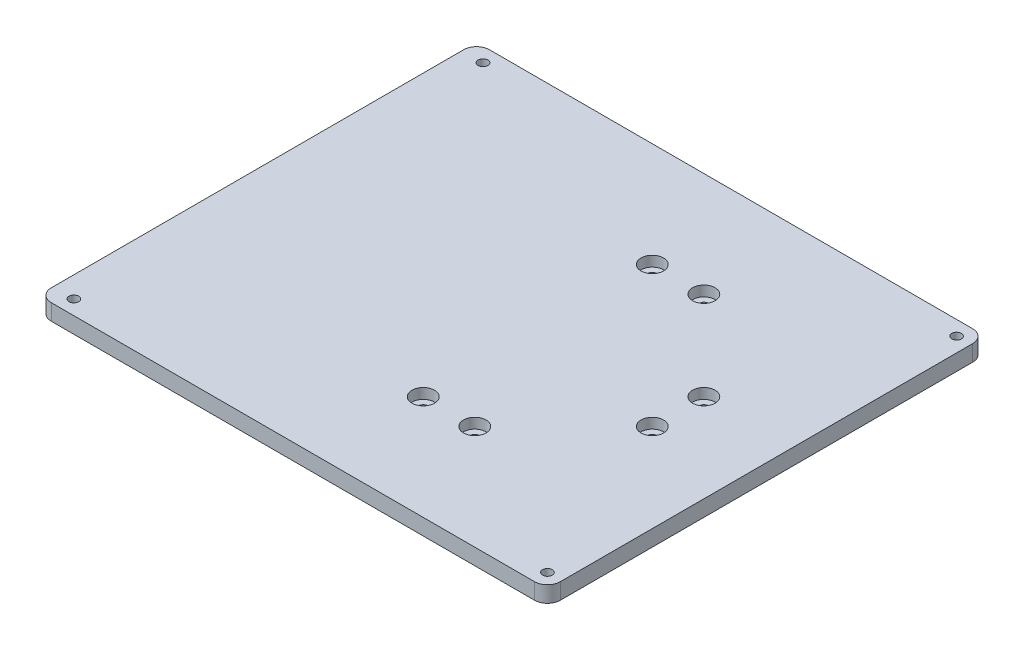
ISO-10303-21;
HEADER;
FILE_DESCRIPTION(('STEP AP214'),'2;1');
FILE_NAME('part.step','',(''),(''),'','','');
FILE_SCHEMA(('AUTOMOTIVE_DESIGN { 1 0 10303 214 1 1 1 1 }'));
ENDSEC;
DATA;
#1=APPLICATION_CONTEXT('core data for automotive mechanical design processes');
#2=APPLICATION_PROTOCOL_DEFINITION('international standard','automotive_design',2000,#1);
#3=PRODUCT_CONTEXT('',#1,'mechanical');
#4=PRODUCT('Part','Part','',(#3));
#5=PRODUCT_RELATED_PRODUCT_CATEGORY('part','',(#4));
#6=PRODUCT_DEFINITION_FORMATION('','',#4);
#7=PRODUCT_DEFINITION_CONTEXT('part definition',#1,'design');
#8=PRODUCT_DEFINITION('design','',#6,#7);
#9=PRODUCT_DEFINITION_SHAPE('','',#8);
#10=(LENGTH_UNIT() NAMED_UNIT(*) SI_UNIT(.MILLI.,.METRE.));
#11=(NAMED_UNIT(*) PLANE_ANGLE_UNIT() SI_UNIT($,.RADIAN.));
#12=(NAMED_UNIT(*) SI_UNIT($,.STERADIAN.) SOLID_ANGLE_UNIT());
#13=UNCERTAINTY_MEASURE_WITH_UNIT(LENGTH_MEASURE(1.E-05),#10,'distance_accuracy_value','');
#14=(GEOMETRIC_REPRESENTATION_CONTEXT(3) GLOBAL_UNCERTAINTY_ASSIGNED_CONTEXT((#13)) GLOBAL_UNIT_ASSIGNED_CONTEXT((#10,
#11,#12)) REPRESENTATION_CONTEXT('',''));
#15=CARTESIAN_POINT('',(0.,0.,0.));
#16=DIRECTION('',(0.,0.,1.));
#17=DIRECTION('',(1.,0.,0.));
#18=AXIS2_PLACEMENT_3D('',#15,#16,#17);
#19=CARTESIAN_POINT('',(24.,0.,-35.55));
#20=DIRECTION('',(0.,1.,0.));
#21=DIRECTION('',(0.,0.,1.));
#22=AXIS2_PLACEMENT_3D('',#19,#20,#21);
#23=CYLINDRICAL_SURFACE('',#22,1.5);
#24=CARTESIAN_POINT('',(24.,0.,-35.55));
#25=DIRECTION('',(0.,1.,0.));
#26=DIRECTION('',(0.,0.,1.));
#27=AXIS2_PLACEMENT_3D('',#24,#25,#26);
#28=CIRCLE('',#27,1.5);
#29=CARTESIAN_POINT('',(24.,0.,-34.05));
#30=VERTEX_POINT('',#29);
#31=EDGE_CURVE('E201',#30,#30,#28,.T.);
#32=ORIENTED_EDGE('',*,*,#31,.F.);
#33=EDGE_LOOP('',(#32));
#34=FACE_BOUND('',#33,.T.);
#35=CARTESIAN_POINT('',(24.,1.8,-35.55));
#36=DIRECTION('',(0.,1.,0.));
#37=DIRECTION('',(0.,0.,1.));
#38=AXIS2_PLACEMENT_3D('',#35,#36,#37);
#39=CIRCLE('',#38,1.5);
#40=CARTESIAN_POINT('',(24.,1.8,-34.05));
#41=VERTEX_POINT('',#40);
#42=EDGE_CURVE('E45',#41,#41,#39,.F.);
#43=ORIENTED_EDGE('',*,*,#42,.F.);
#44=EDGE_LOOP('',(#43));
#45=FACE_BOUND('',#44,.T.);
#46=ADVANCED_FACE('F41',(#34,#45),#23,.F.);
#47=CARTESIAN_POINT('',(51.55,0.,-7.99999999999999));
#48=DIRECTION('',(0.,1.,0.));
#49=DIRECTION('',(0.,0.,1.));
#50=AXIS2_PLACEMENT_3D('',#47,#48,#49);
#51=CYLINDRICAL_SURFACE('',#50,1.5);
#52=CARTESIAN_POINT('',(51.55,0.,-7.99999999999999));
#53=DIRECTION('',(0.,1.,0.));
#54=DIRECTION('',(0.,0.,-1.));
#55=AXIS2_PLACEMENT_3D('',#52,#53,#54);
#56=CIRCLE('',#55,1.5);
#57=CARTESIAN_POINT('',(51.55,0.,-9.49999999999999));
#58=VERTEX_POINT('',#57);
#59=EDGE_CURVE('E183',#58,#58,#56,.T.);
#60=ORIENTED_EDGE('',*,*,#59,.F.);
#61=EDGE_LOOP('',(#60));
#62=FACE_BOUND('',#61,.T.);
#63=CARTESIAN_POINT('',(51.55,1.8,-7.99999999999999));
#64=DIRECTION('',(0.,1.,0.));
#65=DIRECTION('',(0.,0.,1.));
#66=AXIS2_PLACEMENT_3D('',#63,#64,#65);
#67=CIRCLE('',#66,1.5);
#68=CARTESIAN_POINT('',(51.55,1.8,-6.5));
#69=VERTEX_POINT('',#68);
#70=EDGE_CURVE('E178',#69,#69,#67,.F.);
#71=ORIENTED_EDGE('',*,*,#70,.F.);
#72=EDGE_LOOP('',(#71));
#73=FACE_BOUND('',#72,.T.);
#74=ADVANCED_FACE('F263',(#62,#73),#51,.F.);
#75=CARTESIAN_POINT('',(51.55,0.,8.00000000000001));
#76=DIRECTION('',(0.,1.,0.));
#77=DIRECTION('',(0.,0.,1.));
#78=AXIS2_PLACEMENT_3D('',#75,#76,#77);
#79=CYLINDRICAL_SURFACE('',#78,1.5);
#80=CARTESIAN_POINT('',(51.55,0.,8.00000000000001));
#81=DIRECTION('',(0.,1.,0.));
#82=DIRECTION('',(0.,0.,1.));
#83=AXIS2_PLACEMENT_3D('',#80,#81,#82);
#84=CIRCLE('',#83,1.5);
#85=CARTESIAN_POINT('',(51.55,0.,9.5));
#86=VERTEX_POINT('',#85);
#87=EDGE_CURVE('E187',#86,#86,#84,.T.);
#88=ORIENTED_EDGE('',*,*,#87,.F.);
#89=EDGE_LOOP('',(#88));
#90=FACE_BOUND('',#89,.T.);
#91=CARTESIAN_POINT('',(51.55,1.8,8.00000000000001));
#92=DIRECTION('',(0.,1.,0.));
#93=DIRECTION('',(0.,0.,1.));
#94=AXIS2_PLACEMENT_3D('',#91,#92,#93);
#95=CIRCLE('',#94,1.5);
#96=CARTESIAN_POINT('',(51.55,1.8,9.5));
#97=VERTEX_POINT('',#96);
#98=EDGE_CURVE('E176',#97,#97,#95,.F.);
#99=ORIENTED_EDGE('',*,*,#98,.F.);
#100=EDGE_LOOP('',(#99));
#101=FACE_BOUND('',#100,.T.);
#102=ADVANCED_FACE('F270',(#90,#101),#79,.F.);
#103=CARTESIAN_POINT('',(8.00000000000001,0.,-35.55));
#104=DIRECTION('',(0.,1.,0.));
#105=DIRECTION('',(0.,0.,1.));
#106=AXIS2_PLACEMENT_3D('',#103,#104,#105);
#107=CYLINDRICAL_SURFACE('',#106,1.5);
#108=CARTESIAN_POINT('',(8.00000000000001,0.,-35.55));
#109=DIRECTION('',(0.,1.,0.));
#110=DIRECTION('',(0.,0.,-1.));
#111=AXIS2_PLACEMENT_3D('',#108,#109,#110);
#112=CIRCLE('',#111,1.5);
#113=CARTESIAN_POINT('',(8.00000000000001,0.,-37.05));
#114=VERTEX_POINT('',#113);
#115=EDGE_CURVE('E192',#114,#114,#112,.T.);
#116=ORIENTED_EDGE('',*,*,#115,.F.);
#117=EDGE_LOOP('',(#116));
#118=FACE_BOUND('',#117,.T.);
#119=CARTESIAN_POINT('',(8.00000000000001,1.8,-35.55));
#120=DIRECTION('',(0.,1.,0.));
#121=DIRECTION('',(0.,0.,1.));
#122=AXIS2_PLACEMENT_3D('',#119,#120,#121);
#123=CIRCLE('',#122,1.5);
#124=CARTESIAN_POINT('',(8.00000000000001,1.8,-34.05));
#125=VERTEX_POINT('',#124);
#126=EDGE_CURVE('E173',#125,#125,#123,.F.);
#127=ORIENTED_EDGE('',*,*,#126,.F.);
#128=EDGE_LOOP('',(#127));
#129=FACE_BOUND('',#128,.T.);
#130=ADVANCED_FACE('F315',(#118,#129),#107,.F.);
#131=CARTESIAN_POINT('',(8.,0.,35.55));
#132=DIRECTION('',(0.,1.,0.));
#133=DIRECTION('',(0.,0.,1.));
#134=AXIS2_PLACEMENT_3D('',#131,#132,#133);
#135=CYLINDRICAL_SURFACE('',#134,1.5);
#136=CARTESIAN_POINT('',(8.,0.,35.55));
#137=DIRECTION('',(0.,1.,0.));
#138=DIRECTION('',(0.,0.,1.));
#139=AXIS2_PLACEMENT_3D('',#136,#137,#138);
#140=CIRCLE('',#139,1.5);
#141=CARTESIAN_POINT('',(8.,0.,37.05));
#142=VERTEX_POINT('',#141);
#143=EDGE_CURVE('E202',#142,#142,#140,.T.);
#144=ORIENTED_EDGE('',*,*,#143,.F.);
#145=EDGE_LOOP('',(#144));
#146=FACE_BOUND('',#145,.T.);
#147=CARTESIAN_POINT('',(8.,1.8,35.55));
#148=DIRECTION('',(0.,1.,0.));
#149=DIRECTION('',(0.,0.,1.));
#150=AXIS2_PLACEMENT_3D('',#147,#148,#149);
#151=CIRCLE('',#150,1.5);
#152=CARTESIAN_POINT('',(8.,1.8,37.05));
#153=VERTEX_POINT('',#152);
#154=EDGE_CURVE('E169',#153,#153,#151,.F.);
#155=ORIENTED_EDGE('',*,*,#154,.F.);
#156=EDGE_LOOP('',(#155));
#157=FACE_BOUND('',#156,.T.);
#158=ADVANCED_FACE('F357',(#146,#157),#135,.F.);
#159=CARTESIAN_POINT('',(24.,0.,35.55));
#160=DIRECTION('',(0.,1.,0.));
#161=DIRECTION('',(0.,0.,1.));
#162=AXIS2_PLACEMENT_3D('',#159,#160,#161);
#163=CYLINDRICAL_SURFACE('',#162,1.5);
#164=CARTESIAN_POINT('',(24.,0.,35.55));
#165=DIRECTION('',(0.,1.,0.));
#166=DIRECTION('',(0.,0.,-1.));
#167=AXIS2_PLACEMENT_3D('',#164,#165,#166);
#168=CIRCLE('',#167,1.5);
#169=CARTESIAN_POINT('',(24.,0.,34.05));
#170=VERTEX_POINT('',#169);
#171=EDGE_CURVE('E198',#170,#170,#168,.T.);
#172=ORIENTED_EDGE('',*,*,#171,.F.);
#173=EDGE_LOOP('',(#172));
#174=FACE_BOUND('',#173,.T.);
#175=CARTESIAN_POINT('',(24.,1.8,35.55));
#176=DIRECTION('',(0.,1.,0.));
#177=DIRECTION('',(0.,0.,1.));
#178=AXIS2_PLACEMENT_3D('',#175,#176,#177);
#179=CIRCLE('',#178,1.5);
#180=CARTESIAN_POINT('',(24.,1.8,37.05));
#181=VERTEX_POINT('',#180);
#182=EDGE_CURVE('E166',#181,#181,#179,.F.);
#183=ORIENTED_EDGE('',*,*,#182,.F.);
#184=EDGE_LOOP('',(#183));
#185=FACE_BOUND('',#184,.T.);
#186=ADVANCED_FACE('F295',(#174,#185),#163,.F.);
#187=CARTESIAN_POINT('',(0.,5.,0.));
#188=DIRECTION('',(0.,1.,0.));
#189=DIRECTION('',(0.,0.,1.));
#190=AXIS2_PLACEMENT_3D('',#187,#188,#189);
#191=PLANE('',#190);
#192=CARTESIAN_POINT('',(8.00000000000001,5.,-35.55));
#193=DIRECTION('',(0.,1.,0.));
#194=DIRECTION('',(0.,0.,1.));
#195=AXIS2_PLACEMENT_3D('',#192,#193,#194);
#196=CIRCLE('',#195,3.5);
#197=CARTESIAN_POINT('',(8.00000000000001,5.,-32.05));
#198=VERTEX_POINT('',#197);
#199=EDGE_CURVE('E410',#198,#198,#196,.T.);
#200=ORIENTED_EDGE('',*,*,#199,.F.);
#201=EDGE_LOOP('',(#200));
#202=FACE_BOUND('',#201,.T.);
#203=CARTESIAN_POINT('',(51.55,5.,-7.99999999999999));
#204=DIRECTION('',(0.,1.,0.));
#205=DIRECTION('',(0.,0.,1.));
#206=AXIS2_PLACEMENT_3D('',#203,#204,#205);
#207=CIRCLE('',#206,3.5);
#208=CARTESIAN_POINT('',(51.55,5.,-4.5));
#209=VERTEX_POINT('',#208);
#210=EDGE_CURVE('E389',#209,#209,#207,.T.);
#211=ORIENTED_EDGE('',*,*,#210,.F.);
#212=EDGE_LOOP('',(#211));
#213=FACE_BOUND('',#212,.T.);
#214=CARTESIAN_POINT('',(51.55,5.,8.00000000000001));
#215=DIRECTION('',(0.,1.,0.));
#216=DIRECTION('',(0.,0.,1.));
#217=AXIS2_PLACEMENT_3D('',#214,#215,#216);
#218=CIRCLE('',#217,3.5);
#219=CARTESIAN_POINT('',(51.55,5.,11.5));
#220=VERTEX_POINT('',#219);
#221=EDGE_CURVE('E390',#220,#220,#218,.T.);
#222=ORIENTED_EDGE('',*,*,#221,.F.);
#223=EDGE_LOOP('',(#222));
#224=FACE_BOUND('',#223,.T.);
#225=CARTESIAN_POINT('',(24.,5.,35.55));
#226=DIRECTION('',(0.,1.,0.));
#227=DIRECTION('',(0.,0.,1.));
#228=AXIS2_PLACEMENT_3D('',#225,#226,#227);
#229=CIRCLE('',#228,3.5);
#230=CARTESIAN_POINT('',(24.,5.,39.05));
#231=VERTEX_POINT('',#230);
#232=EDGE_CURVE('E401',#231,#231,#229,.T.);
#233=ORIENTED_EDGE('',*,*,#232,.F.);
#234=EDGE_LOOP('',(#233));
#235=FACE_BOUND('',#234,.T.);
#236=CARTESIAN_POINT('',(8.,5.,35.55));
#237=DIRECTION('',(0.,1.,0.));
#238=DIRECTION('',(0.,0.,1.));
#239=AXIS2_PLACEMENT_3D('',#236,#237,#238);
#240=CIRCLE('',#239,3.5);
#241=CARTESIAN_POINT('',(8.,5.,39.05));
#242=VERTEX_POINT('',#241);
#243=EDGE_CURVE('E406',#242,#242,#240,.T.);
#244=ORIENTED_EDGE('',*,*,#243,.F.);
#245=EDGE_LOOP('',(#244));
#246=FACE_BOUND('',#245,.T.);
#247=CARTESIAN_POINT('',(24.,5.,-35.55));
#248=DIRECTION('',(0.,1.,0.));
#249=DIRECTION('',(0.,0.,1.));
#250=AXIS2_PLACEMENT_3D('',#247,#248,#249);
#251=CIRCLE('',#250,3.5);
#252=CARTESIAN_POINT('',(24.,5.,-32.05));
#253=VERTEX_POINT('',#252);
#254=EDGE_CURVE('E196',#253,#253,#251,.T.);
#255=ORIENTED_EDGE('',*,*,#254,.F.);
#256=EDGE_LOOP('',(#255));
#257=FACE_BOUND('',#256,.T.);
#258=CARTESIAN_POINT('',(-72.4999999999997,5.,63.5000000000006));
#259=DIRECTION('',(0.,1.,0.));
#260=DIRECTION('',(0.,0.,-1.));
#261=AXIS2_PLACEMENT_3D('',#258,#259,#260);
#262=CIRCLE('',#261,1.5);
#263=CARTESIAN_POINT('',(-72.4999999999997,5.,62.0000000000006));
#264=VERTEX_POINT('',#263);
#265=EDGE_CURVE('E216',#264,#264,#262,.T.);
#266=ORIENTED_EDGE('',*,*,#265,.F.);
#267=EDGE_LOOP('',(#266));
#268=FACE_BOUND('',#267,.T.);
#269=CARTESIAN_POINT('',(74.5,5.,-63.5));
#270=DIRECTION('',(0.,1.,0.));
#271=DIRECTION('',(0.,0.,1.));
#272=AXIS2_PLACEMENT_3D('',#269,#270,#271);
#273=CIRCLE('',#272,1.5);
#274=CARTESIAN_POINT('',(74.5,5.,-62.));
#275=VERTEX_POINT('',#274);
#276=EDGE_CURVE('E228',#275,#275,#273,.T.);
#277=ORIENTED_EDGE('',*,*,#276,.F.);
#278=EDGE_LOOP('',(#277));
#279=FACE_BOUND('',#278,.T.);
#280=DIRECTION('',(0.,0.,1.));
#281=VECTOR('',#280,1.);
#282=CARTESIAN_POINT('',(-79.,5.,-68.));
#283=LINE('',#282,#281);
#284=CARTESIAN_POINT('',(-79.,5.,-64.));
#285=VERTEX_POINT('',#284);
#286=CARTESIAN_POINT('',(-79.,5.,64.));
#287=VERTEX_POINT('',#286);
#288=EDGE_CURVE('E235',#285,#287,#283,.T.);
#289=ORIENTED_EDGE('',*,*,#288,.T.);
#290=CARTESIAN_POINT('',(-75.,5.,64.));
#291=DIRECTION('',(0.,1.,0.));
#292=DIRECTION('',(0.,0.,1.));
#293=AXIS2_PLACEMENT_3D('',#290,#291,#292);
#294=CIRCLE('',#293,4.);
#295=CARTESIAN_POINT('',(-75.,5.,68.));
#296=VERTEX_POINT('',#295);
#297=EDGE_CURVE('E158',#287,#296,#294,.T.);
#298=ORIENTED_EDGE('',*,*,#297,.T.);
#299=DIRECTION('',(1.,0.,0.));
#300=VECTOR('',#299,1.);
#301=CARTESIAN_POINT('',(-79.,5.,68.));
#302=LINE('',#301,#300);
#303=CARTESIAN_POINT('',(75.,5.,68.));
#304=VERTEX_POINT('',#303);
#305=EDGE_CURVE('E129',#296,#304,#302,.T.);
#306=ORIENTED_EDGE('',*,*,#305,.T.);
#307=CARTESIAN_POINT('',(75.,5.,64.));
#308=DIRECTION('',(0.,1.,0.));
#309=DIRECTION('',(0.,0.,1.));
#310=AXIS2_PLACEMENT_3D('',#307,#308,#309);
#311=CIRCLE('',#310,4.);
#312=CARTESIAN_POINT('',(79.,5.,64.));
#313=VERTEX_POINT('',#312);
#314=EDGE_CURVE('E153',#304,#313,#311,.T.);
#315=ORIENTED_EDGE('',*,*,#314,.T.);
#316=DIRECTION('',(0.,0.,-1.));
#317=VECTOR('',#316,1.);
#318=CARTESIAN_POINT('',(79.,5.,-68.));
#319=LINE('',#318,#317);
#320=CARTESIAN_POINT('',(79.,5.,-64.));
#321=VERTEX_POINT('',#320);
#322=EDGE_CURVE('E136',#313,#321,#319,.T.);
#323=ORIENTED_EDGE('',*,*,#322,.T.);
#324=CARTESIAN_POINT('',(75.,5.,-64.));
#325=DIRECTION('',(0.,1.,0.));
#326=DIRECTION('',(0.,0.,1.));
#327=AXIS2_PLACEMENT_3D('',#324,#325,#326);
#328=CIRCLE('',#327,4.);
#329=CARTESIAN_POINT('',(75.,5.,-68.));
#330=VERTEX_POINT('',#329);
#331=EDGE_CURVE('E65',#321,#330,#328,.T.);
#332=ORIENTED_EDGE('',*,*,#331,.T.);
#333=DIRECTION('',(-1.,0.,0.));
#334=VECTOR('',#333,1.);
#335=CARTESIAN_POINT('',(-79.,5.,-68.));
#336=LINE('',#335,#334);
#337=CARTESIAN_POINT('',(-75.,5.,-68.));
#338=VERTEX_POINT('',#337);
#339=EDGE_CURVE('E139',#330,#338,#336,.T.);
#340=ORIENTED_EDGE('',*,*,#339,.T.);
#341=CARTESIAN_POINT('',(-75.,5.,-64.));
#342=DIRECTION('',(0.,1.,0.));
#343=DIRECTION('',(0.,0.,1.));
#344=AXIS2_PLACEMENT_3D('',#341,#342,#343);
#345=CIRCLE('',#344,4.);
#346=EDGE_CURVE('E156',#338,#285,#345,.T.);
#347=ORIENTED_EDGE('',*,*,#346,.T.);
#348=EDGE_LOOP('',(#289,#298,#306,#315,#323,#332,#340,#347));
#349=FACE_BOUND('',#348,.T.);
#350=CARTESIAN_POINT('',(-72.5,5.,-63.5));
#351=DIRECTION('',(0.,1.,0.));
#352=DIRECTION('',(0.,0.,1.));
#353=AXIS2_PLACEMENT_3D('',#350,#351,#352);
#354=CIRCLE('',#353,1.5);
#355=CARTESIAN_POINT('',(-72.5,5.,-62.));
#356=VERTEX_POINT('',#355);
#357=EDGE_CURVE('E222',#356,#356,#354,.T.);
#358=ORIENTED_EDGE('',*,*,#357,.F.);
#359=EDGE_LOOP('',(#358));
#360=FACE_BOUND('',#359,.T.);
#361=CARTESIAN_POINT('',(74.5000000000002,5.,63.5));
#362=DIRECTION('',(0.,1.,0.));
#363=DIRECTION('',(0.,0.,-1.));
#364=AXIS2_PLACEMENT_3D('',#361,#362,#363);
#365=CIRCLE('',#364,1.49999999999999);
#366=CARTESIAN_POINT('',(74.5000000000002,5.,62.));
#367=VERTEX_POINT('',#366);
#368=EDGE_CURVE('E210',#367,#367,#365,.T.);
#369=ORIENTED_EDGE('',*,*,#368,.F.);
#370=EDGE_LOOP('',(#369));
#371=FACE_BOUND('',#370,.T.);
#372=ADVANCED_FACE('F248',(#202,#213,#224,#235,#246,#257,#268,#279,#349,#360,#371),#191,.T.);
#373=CARTESIAN_POINT('',(0.,0.,0.));
#374=DIRECTION('',(0.,1.,0.));
#375=DIRECTION('',(0.,0.,1.));
#376=AXIS2_PLACEMENT_3D('',#373,#374,#375);
#377=PLANE('',#376);
#378=ORIENTED_EDGE('',*,*,#171,.T.);
#379=EDGE_LOOP('',(#378));
#380=FACE_BOUND('',#379,.T.);
#381=ORIENTED_EDGE('',*,*,#143,.T.);
#382=EDGE_LOOP('',(#381));
#383=FACE_BOUND('',#382,.T.);
#384=ORIENTED_EDGE('',*,*,#115,.T.);
#385=EDGE_LOOP('',(#384));
#386=FACE_BOUND('',#385,.T.);
#387=ORIENTED_EDGE('',*,*,#87,.T.);
#388=EDGE_LOOP('',(#387));
#389=FACE_BOUND('',#388,.T.);
#390=ORIENTED_EDGE('',*,*,#59,.T.);
#391=EDGE_LOOP('',(#390));
#392=FACE_BOUND('',#391,.T.);
#393=ORIENTED_EDGE('',*,*,#31,.T.);
#394=EDGE_LOOP('',(#393));
#395=FACE_BOUND('',#394,.T.);
#396=DIRECTION('',(1.,0.,0.));
#397=VECTOR('',#396,1.);
#398=CARTESIAN_POINT('',(-79.,0.,68.));
#399=LINE('',#398,#397);
#400=CARTESIAN_POINT('',(-75.,0.,68.));
#401=VERTEX_POINT('',#400);
#402=CARTESIAN_POINT('',(75.,0.,68.));
#403=VERTEX_POINT('',#402);
#404=EDGE_CURVE('E126',#401,#403,#399,.T.);
#405=ORIENTED_EDGE('',*,*,#404,.F.);
#406=CARTESIAN_POINT('',(-75.,0.,64.));
#407=DIRECTION('',(0.,1.,0.));
#408=DIRECTION('',(0.,0.,1.));
#409=AXIS2_PLACEMENT_3D('',#406,#407,#408);
#410=CIRCLE('',#409,4.);
#411=CARTESIAN_POINT('',(-79.,0.,64.));
#412=VERTEX_POINT('',#411);
#413=EDGE_CURVE('E109',#401,#412,#410,.F.);
#414=ORIENTED_EDGE('',*,*,#413,.T.);
#415=DIRECTION('',(0.,0.,1.));
#416=VECTOR('',#415,1.);
#417=CARTESIAN_POINT('',(-79.,0.,-68.));
#418=LINE('',#417,#416);
#419=CARTESIAN_POINT('',(-79.,0.,-64.));
#420=VERTEX_POINT('',#419);
#421=EDGE_CURVE('E137',#420,#412,#418,.T.);
#422=ORIENTED_EDGE('',*,*,#421,.F.);
#423=CARTESIAN_POINT('',(-75.,0.,-64.));
#424=DIRECTION('',(0.,1.,0.));
#425=DIRECTION('',(0.,0.,1.));
#426=AXIS2_PLACEMENT_3D('',#423,#424,#425);
#427=CIRCLE('',#426,4.);
#428=CARTESIAN_POINT('',(-75.,0.,-68.));
#429=VERTEX_POINT('',#428);
#430=EDGE_CURVE('E120',#420,#429,#427,.F.);
#431=ORIENTED_EDGE('',*,*,#430,.T.);
#432=DIRECTION('',(-1.,0.,0.));
#433=VECTOR('',#432,1.);
#434=CARTESIAN_POINT('',(-79.,0.,-68.));
#435=LINE('',#434,#433);
#436=CARTESIAN_POINT('',(75.,0.,-68.));
#437=VERTEX_POINT('',#436);
#438=EDGE_CURVE('E141',#437,#429,#435,.T.);
#439=ORIENTED_EDGE('',*,*,#438,.F.);
#440=CARTESIAN_POINT('',(75.,0.,-64.));
#441=DIRECTION('',(0.,1.,0.));
#442=DIRECTION('',(0.,0.,1.));
#443=AXIS2_PLACEMENT_3D('',#440,#441,#442);
#444=CIRCLE('',#443,4.);
#445=CARTESIAN_POINT('',(79.,0.,-64.));
#446=VERTEX_POINT('',#445);
#447=EDGE_CURVE('E147',#437,#446,#444,.F.);
#448=ORIENTED_EDGE('',*,*,#447,.T.);
#449=DIRECTION('',(0.,0.,-1.));
#450=VECTOR('',#449,1.);
#451=CARTESIAN_POINT('',(79.,0.,-68.));
#452=LINE('',#451,#450);
#453=CARTESIAN_POINT('',(79.,0.,64.));
#454=VERTEX_POINT('',#453);
#455=EDGE_CURVE('E231',#454,#446,#452,.T.);
#456=ORIENTED_EDGE('',*,*,#455,.F.);
#457=CARTESIAN_POINT('',(75.,0.,64.));
#458=DIRECTION('',(0.,1.,0.));
#459=DIRECTION('',(0.,0.,1.));
#460=AXIS2_PLACEMENT_3D('',#457,#458,#459);
#461=CIRCLE('',#460,4.);
#462=EDGE_CURVE('E130',#454,#403,#461,.F.);
#463=ORIENTED_EDGE('',*,*,#462,.T.);
#464=EDGE_LOOP('',(#405,#414,#422,#431,#439,#448,#456,#463));
#465=FACE_BOUND('',#464,.T.);
#466=CARTESIAN_POINT('',(74.5,0.,-63.5));
#467=DIRECTION('',(0.,1.,0.));
#468=DIRECTION('',(0.,0.,1.));
#469=AXIS2_PLACEMENT_3D('',#466,#467,#468);
#470=CIRCLE('',#469,1.5);
#471=CARTESIAN_POINT('',(74.5,0.,-62.));
#472=VERTEX_POINT('',#471);
#473=EDGE_CURVE('E225',#472,#472,#470,.T.);
#474=ORIENTED_EDGE('',*,*,#473,.T.);
#475=EDGE_LOOP('',(#474));
#476=FACE_BOUND('',#475,.T.);
#477=CARTESIAN_POINT('',(-72.5,0.,-63.5));
#478=DIRECTION('',(0.,1.,0.));
#479=DIRECTION('',(0.,0.,1.));
#480=AXIS2_PLACEMENT_3D('',#477,#478,#479);
#481=CIRCLE('',#480,1.5);
#482=CARTESIAN_POINT('',(-72.5,0.,-62.));
#483=VERTEX_POINT('',#482);
#484=EDGE_CURVE('E219',#483,#483,#481,.T.);
#485=ORIENTED_EDGE('',*,*,#484,.T.);
#486=EDGE_LOOP('',(#485));
#487=FACE_BOUND('',#486,.T.);
#488=CARTESIAN_POINT('',(-72.4999999999997,0.,63.5000000000006));
#489=DIRECTION('',(0.,1.,0.));
#490=DIRECTION('',(0.,0.,-1.));
#491=AXIS2_PLACEMENT_3D('',#488,#489,#490);
#492=CIRCLE('',#491,1.5);
#493=CARTESIAN_POINT('',(-72.4999999999997,0.,62.0000000000006));
#494=VERTEX_POINT('',#493);
#495=EDGE_CURVE('E213',#494,#494,#492,.T.);
#496=ORIENTED_EDGE('',*,*,#495,.T.);
#497=EDGE_LOOP('',(#496));
#498=FACE_BOUND('',#497,.T.);
#499=CARTESIAN_POINT('',(74.5000000000002,0.,63.5));
#500=DIRECTION('',(0.,1.,0.));
#501=DIRECTION('',(0.,0.,-1.));
#502=AXIS2_PLACEMENT_3D('',#499,#500,#501);
#503=CIRCLE('',#502,1.49999999999999);
#504=CARTESIAN_POINT('',(74.5000000000002,0.,62.));
#505=VERTEX_POINT('',#504);
#506=EDGE_CURVE('E209',#505,#505,#503,.T.);
#507=ORIENTED_EDGE('',*,*,#506,.T.);
#508=EDGE_LOOP('',(#507));
#509=FACE_BOUND('',#508,.T.);
#510=ADVANCED_FACE('F133',(#380,#383,#386,#389,#392,#395,#465,#476,#487,#498,#509),#377,.F.);
#511=CARTESIAN_POINT('',(79.,5.,-68.));
#512=DIRECTION('',(-1.,0.,0.));
#513=DIRECTION('',(0.,0.,1.));
#514=AXIS2_PLACEMENT_3D('',#511,#512,#513);
#515=PLANE('',#514);
#516=ORIENTED_EDGE('',*,*,#455,.T.);
#517=DIRECTION('',(0.,-1.,0.));
#518=VECTOR('',#517,1.);
#519=CARTESIAN_POINT('',(79.,5.,-64.));
#520=LINE('',#519,#518);
#521=EDGE_CURVE('E11',#446,#321,#520,.F.);
#522=ORIENTED_EDGE('',*,*,#521,.T.);
#523=ORIENTED_EDGE('',*,*,#322,.F.);
#524=DIRECTION('',(0.,-1.,0.));
#525=VECTOR('',#524,1.);
#526=CARTESIAN_POINT('',(79.,5.,64.));
#527=LINE('',#526,#525);
#528=EDGE_CURVE('E50',#313,#454,#527,.T.);
#529=ORIENTED_EDGE('',*,*,#528,.T.);
#530=EDGE_LOOP('',(#516,#522,#523,#529));
#531=FACE_BOUND('',#530,.T.);
#532=ADVANCED_FACE('F260',(#531),#515,.F.);
#533=CARTESIAN_POINT('',(-79.,5.,-68.));
#534=DIRECTION('',(0.,0.,1.));
#535=DIRECTION('',(1.,0.,0.));
#536=AXIS2_PLACEMENT_3D('',#533,#534,#535);
#537=PLANE('',#536);
#538=ORIENTED_EDGE('',*,*,#438,.T.);
#539=DIRECTION('',(0.,-1.,0.));
#540=VECTOR('',#539,1.);
#541=CARTESIAN_POINT('',(-75.,5.,-68.));
#542=LINE('',#541,#540);
#543=EDGE_CURVE('E58',#429,#338,#542,.F.);
#544=ORIENTED_EDGE('',*,*,#543,.T.);
#545=ORIENTED_EDGE('',*,*,#339,.F.);
#546=DIRECTION('',(0.,-1.,0.));
#547=VECTOR('',#546,1.);
#548=CARTESIAN_POINT('',(75.,5.,-68.));
#549=LINE('',#548,#547);
#550=EDGE_CURVE('E160',#330,#437,#549,.T.);
#551=ORIENTED_EDGE('',*,*,#550,.T.);
#552=EDGE_LOOP('',(#538,#544,#545,#551));
#553=FACE_BOUND('',#552,.T.);
#554=ADVANCED_FACE('F241',(#553),#537,.F.);
#555=CARTESIAN_POINT('',(-79.,5.,-68.));
#556=DIRECTION('',(1.,0.,0.));
#557=DIRECTION('',(0.,0.,-1.));
#558=AXIS2_PLACEMENT_3D('',#555,#556,#557);
#559=PLANE('',#558);
#560=ORIENTED_EDGE('',*,*,#421,.T.);
#561=DIRECTION('',(0.,-1.,0.));
#562=VECTOR('',#561,1.);
#563=CARTESIAN_POINT('',(-79.,5.,64.));
#564=LINE('',#563,#562);
#565=EDGE_CURVE('E114',#412,#287,#564,.F.);
#566=ORIENTED_EDGE('',*,*,#565,.T.);
#567=ORIENTED_EDGE('',*,*,#288,.F.);
#568=DIRECTION('',(0.,-1.,0.));
#569=VECTOR('',#568,1.);
#570=CARTESIAN_POINT('',(-79.,5.,-64.));
#571=LINE('',#570,#569);
#572=EDGE_CURVE('E119',#285,#420,#571,.T.);
#573=ORIENTED_EDGE('',*,*,#572,.T.);
#574=EDGE_LOOP('',(#560,#566,#567,#573));
#575=FACE_BOUND('',#574,.T.);
#576=ADVANCED_FACE('F251',(#575),#559,.F.);
#577=CARTESIAN_POINT('',(-79.,5.,68.));
#578=DIRECTION('',(0.,0.,-1.));
#579=DIRECTION('',(-1.,0.,0.));
#580=AXIS2_PLACEMENT_3D('',#577,#578,#579);
#581=PLANE('',#580);
#582=ORIENTED_EDGE('',*,*,#305,.F.);
#583=DIRECTION('',(0.,-1.,0.));
#584=VECTOR('',#583,1.);
#585=CARTESIAN_POINT('',(-75.,5.,68.));
#586=LINE('',#585,#584);
#587=EDGE_CURVE('E113',#296,#401,#586,.T.);
#588=ORIENTED_EDGE('',*,*,#587,.T.);
#589=ORIENTED_EDGE('',*,*,#404,.T.);
#590=DIRECTION('',(0.,-1.,0.));
#591=VECTOR('',#590,1.);
#592=CARTESIAN_POINT('',(75.,5.,68.));
#593=LINE('',#592,#591);
#594=EDGE_CURVE('E131',#403,#304,#593,.F.);
#595=ORIENTED_EDGE('',*,*,#594,.T.);
#596=EDGE_LOOP('',(#582,#588,#589,#595));
#597=FACE_BOUND('',#596,.T.);
#598=ADVANCED_FACE('F125',(#597),#581,.F.);
#599=CARTESIAN_POINT('',(74.5,5.,-63.5));
#600=DIRECTION('',(0.,-1.,0.));
#601=DIRECTION('',(0.,0.,-1.));
#602=AXIS2_PLACEMENT_3D('',#599,#600,#601);
#603=CYLINDRICAL_SURFACE('',#602,1.5);
#604=ORIENTED_EDGE('',*,*,#276,.T.);
#605=EDGE_LOOP('',(#604));
#606=FACE_BOUND('',#605,.T.);
#607=ORIENTED_EDGE('',*,*,#473,.F.);
#608=EDGE_LOOP('',(#607));
#609=FACE_BOUND('',#608,.T.);
#610=ADVANCED_FACE('F258',(#606,#609),#603,.F.);
#611=CARTESIAN_POINT('',(-72.5,5.,-63.5));
#612=DIRECTION('',(0.,-1.,0.));
#613=DIRECTION('',(0.,0.,-1.));
#614=AXIS2_PLACEMENT_3D('',#611,#612,#613);
#615=CYLINDRICAL_SURFACE('',#614,1.5);
#616=ORIENTED_EDGE('',*,*,#357,.T.);
#617=EDGE_LOOP('',(#616));
#618=FACE_BOUND('',#617,.T.);
#619=ORIENTED_EDGE('',*,*,#484,.F.);
#620=EDGE_LOOP('',(#619));
#621=FACE_BOUND('',#620,.T.);
#622=ADVANCED_FACE('F285',(#618,#621),#615,.F.);
#623=CARTESIAN_POINT('',(-72.4999999999997,5.,63.5000000000006));
#624=DIRECTION('',(0.,-1.,0.));
#625=DIRECTION('',(0.,0.,-1.));
#626=AXIS2_PLACEMENT_3D('',#623,#624,#625);
#627=CYLINDRICAL_SURFACE('',#626,1.5);
#628=ORIENTED_EDGE('',*,*,#265,.T.);
#629=EDGE_LOOP('',(#628));
#630=FACE_BOUND('',#629,.T.);
#631=ORIENTED_EDGE('',*,*,#495,.F.);
#632=EDGE_LOOP('',(#631));
#633=FACE_BOUND('',#632,.T.);
#634=ADVANCED_FACE('F281',(#630,#633),#627,.F.);
#635=CARTESIAN_POINT('',(74.5000000000002,5.,63.5));
#636=DIRECTION('',(0.,-1.,0.));
#637=DIRECTION('',(0.,0.,-1.));
#638=AXIS2_PLACEMENT_3D('',#635,#636,#637);
#639=CYLINDRICAL_SURFACE('',#638,1.49999999999999);
#640=ORIENTED_EDGE('',*,*,#368,.T.);
#641=EDGE_LOOP('',(#640));
#642=FACE_BOUND('',#641,.T.);
#643=ORIENTED_EDGE('',*,*,#506,.F.);
#644=EDGE_LOOP('',(#643));
#645=FACE_BOUND('',#644,.T.);
#646=ADVANCED_FACE('F278',(#642,#645),#639,.F.);
#647=CARTESIAN_POINT('',(-75.,5.,64.));
#648=DIRECTION('',(0.,-1.,0.));
#649=DIRECTION('',(0.,0.,-1.));
#650=AXIS2_PLACEMENT_3D('',#647,#648,#649);
#651=CYLINDRICAL_SURFACE('',#650,4.);
#652=ORIENTED_EDGE('',*,*,#297,.F.);
#653=ORIENTED_EDGE('',*,*,#565,.F.);
#654=ORIENTED_EDGE('',*,*,#413,.F.);
#655=ORIENTED_EDGE('',*,*,#587,.F.);
#656=EDGE_LOOP('',(#652,#653,#654,#655));
#657=FACE_BOUND('',#656,.T.);
#658=ADVANCED_FACE('F112',(#657),#651,.T.);
#659=CARTESIAN_POINT('',(-75.,5.,-64.));
#660=DIRECTION('',(0.,-1.,0.));
#661=DIRECTION('',(0.,0.,-1.));
#662=AXIS2_PLACEMENT_3D('',#659,#660,#661);
#663=CYLINDRICAL_SURFACE('',#662,4.);
#664=ORIENTED_EDGE('',*,*,#346,.F.);
#665=ORIENTED_EDGE('',*,*,#543,.F.);
#666=ORIENTED_EDGE('',*,*,#430,.F.);
#667=ORIENTED_EDGE('',*,*,#572,.F.);
#668=EDGE_LOOP('',(#664,#665,#666,#667));
#669=FACE_BOUND('',#668,.T.);
#670=ADVANCED_FACE('F245',(#669),#663,.T.);
#671=CARTESIAN_POINT('',(75.,5.,-64.));
#672=DIRECTION('',(0.,-1.,0.));
#673=DIRECTION('',(0.,0.,-1.));
#674=AXIS2_PLACEMENT_3D('',#671,#672,#673);
#675=CYLINDRICAL_SURFACE('',#674,4.);
#676=ORIENTED_EDGE('',*,*,#331,.F.);
#677=ORIENTED_EDGE('',*,*,#521,.F.);
#678=ORIENTED_EDGE('',*,*,#447,.F.);
#679=ORIENTED_EDGE('',*,*,#550,.F.);
#680=EDGE_LOOP('',(#676,#677,#678,#679));
#681=FACE_BOUND('',#680,.T.);
#682=ADVANCED_FACE('F548',(#681),#675,.T.);
#683=CARTESIAN_POINT('',(75.,5.,64.));
#684=DIRECTION('',(0.,-1.,0.));
#685=DIRECTION('',(0.,0.,-1.));
#686=AXIS2_PLACEMENT_3D('',#683,#684,#685);
#687=CYLINDRICAL_SURFACE('',#686,4.);
#688=ORIENTED_EDGE('',*,*,#314,.F.);
#689=ORIENTED_EDGE('',*,*,#594,.F.);
#690=ORIENTED_EDGE('',*,*,#462,.F.);
#691=ORIENTED_EDGE('',*,*,#528,.F.);
#692=EDGE_LOOP('',(#688,#689,#690,#691));
#693=FACE_BOUND('',#692,.T.);
#694=ADVANCED_FACE('F43',(#693),#687,.T.);
#695=CARTESIAN_POINT('',(24.,1.8,35.55));
#696=DIRECTION('',(0.,1.,0.));
#697=DIRECTION('',(0.,0.,1.));
#698=AXIS2_PLACEMENT_3D('',#695,#696,#697);
#699=PLANE('',#698);
#700=CARTESIAN_POINT('',(24.,1.8,35.55));
#701=DIRECTION('',(0.,1.,0.));
#702=DIRECTION('',(0.,0.,1.));
#703=AXIS2_PLACEMENT_3D('',#700,#701,#702);
#704=CIRCLE('',#703,3.5);
#705=CARTESIAN_POINT('',(24.,1.8,39.05));
#706=VERTEX_POINT('',#705);
#707=EDGE_CURVE('E404',#706,#706,#704,.T.);
#708=ORIENTED_EDGE('',*,*,#707,.T.);
#709=EDGE_LOOP('',(#708));
#710=FACE_BOUND('',#709,.T.);
#711=ORIENTED_EDGE('',*,*,#182,.T.);
#712=EDGE_LOOP('',(#711));
#713=FACE_BOUND('',#712,.T.);
#714=ADVANCED_FACE('F341',(#710,#713),#699,.T.);
#715=CARTESIAN_POINT('',(24.,1.8,35.55));
#716=DIRECTION('',(0.,1.,0.));
#717=DIRECTION('',(0.,0.,1.));
#718=AXIS2_PLACEMENT_3D('',#715,#716,#717);
#719=CYLINDRICAL_SURFACE('',#718,3.5);
#720=ORIENTED_EDGE('',*,*,#707,.F.);
#721=EDGE_LOOP('',(#720));
#722=FACE_BOUND('',#721,.T.);
#723=ORIENTED_EDGE('',*,*,#232,.T.);
#724=EDGE_LOOP('',(#723));
#725=FACE_BOUND('',#724,.T.);
#726=ADVANCED_FACE('F337',(#722,#725),#719,.F.);
#727=CARTESIAN_POINT('',(8.,1.8,35.55));
#728=DIRECTION('',(0.,1.,0.));
#729=DIRECTION('',(0.,0.,1.));
#730=AXIS2_PLACEMENT_3D('',#727,#728,#729);
#731=PLANE('',#730);
#732=CARTESIAN_POINT('',(8.,1.8,35.55));
#733=DIRECTION('',(0.,1.,0.));
#734=DIRECTION('',(0.,0.,1.));
#735=AXIS2_PLACEMENT_3D('',#732,#733,#734);
#736=CIRCLE('',#735,3.5);
#737=CARTESIAN_POINT('',(8.,1.8,39.05));
#738=VERTEX_POINT('',#737);
#739=EDGE_CURVE('E418',#738,#738,#736,.T.);
#740=ORIENTED_EDGE('',*,*,#739,.T.);
#741=EDGE_LOOP('',(#740));
#742=FACE_BOUND('',#741,.T.);
#743=ORIENTED_EDGE('',*,*,#154,.T.);
#744=EDGE_LOOP('',(#743));
#745=FACE_BOUND('',#744,.T.);
#746=ADVANCED_FACE('F340',(#742,#745),#731,.T.);
#747=CARTESIAN_POINT('',(8.,1.8,35.55));
#748=DIRECTION('',(0.,1.,0.));
#749=DIRECTION('',(0.,0.,1.));
#750=AXIS2_PLACEMENT_3D('',#747,#748,#749);
#751=CYLINDRICAL_SURFACE('',#750,3.5);
#752=ORIENTED_EDGE('',*,*,#739,.F.);
#753=EDGE_LOOP('',(#752));
#754=FACE_BOUND('',#753,.T.);
#755=ORIENTED_EDGE('',*,*,#243,.T.);
#756=EDGE_LOOP('',(#755));
#757=FACE_BOUND('',#756,.T.);
#758=ADVANCED_FACE('F369',(#754,#757),#751,.F.);
#759=CARTESIAN_POINT('',(8.00000000000001,1.8,-35.55));
#760=DIRECTION('',(0.,1.,0.));
#761=DIRECTION('',(0.,0.,1.));
#762=AXIS2_PLACEMENT_3D('',#759,#760,#761);
#763=PLANE('',#762);
#764=CARTESIAN_POINT('',(8.00000000000001,1.8,-35.55));
#765=DIRECTION('',(0.,1.,0.));
#766=DIRECTION('',(0.,0.,1.));
#767=AXIS2_PLACEMENT_3D('',#764,#765,#766);
#768=CIRCLE('',#767,3.5);
#769=CARTESIAN_POINT('',(8.00000000000001,1.8,-32.05));
#770=VERTEX_POINT('',#769);
#771=EDGE_CURVE('E393',#770,#770,#768,.T.);
#772=ORIENTED_EDGE('',*,*,#771,.T.);
#773=EDGE_LOOP('',(#772));
#774=FACE_BOUND('',#773,.T.);
#775=ORIENTED_EDGE('',*,*,#126,.T.);
#776=EDGE_LOOP('',(#775));
#777=FACE_BOUND('',#776,.T.);
#778=ADVANCED_FACE('F331',(#774,#777),#763,.T.);
#779=CARTESIAN_POINT('',(8.00000000000001,1.8,-35.55));
#780=DIRECTION('',(0.,1.,0.));
#781=DIRECTION('',(0.,0.,1.));
#782=AXIS2_PLACEMENT_3D('',#779,#780,#781);
#783=CYLINDRICAL_SURFACE('',#782,3.5);
#784=ORIENTED_EDGE('',*,*,#771,.F.);
#785=EDGE_LOOP('',(#784));
#786=FACE_BOUND('',#785,.T.);
#787=ORIENTED_EDGE('',*,*,#199,.T.);
#788=EDGE_LOOP('',(#787));
#789=FACE_BOUND('',#788,.T.);
#790=ADVANCED_FACE('F321',(#786,#789),#783,.F.);
#791=CARTESIAN_POINT('',(51.55,1.8,8.00000000000001));
#792=DIRECTION('',(0.,1.,0.));
#793=DIRECTION('',(0.,0.,1.));
#794=AXIS2_PLACEMENT_3D('',#791,#792,#793);
#795=PLANE('',#794);
#796=CARTESIAN_POINT('',(51.55,1.8,8.00000000000001));
#797=DIRECTION('',(0.,1.,0.));
#798=DIRECTION('',(0.,0.,1.));
#799=AXIS2_PLACEMENT_3D('',#796,#797,#798);
#800=CIRCLE('',#799,3.5);
#801=CARTESIAN_POINT('',(51.55,1.8,11.5));
#802=VERTEX_POINT('',#801);
#803=EDGE_CURVE('E396',#802,#802,#800,.T.);
#804=ORIENTED_EDGE('',*,*,#803,.T.);
#805=EDGE_LOOP('',(#804));
#806=FACE_BOUND('',#805,.T.);
#807=ORIENTED_EDGE('',*,*,#98,.T.);
#808=EDGE_LOOP('',(#807));
#809=FACE_BOUND('',#808,.T.);
#810=ADVANCED_FACE('F318',(#806,#809),#795,.T.);
#811=CARTESIAN_POINT('',(51.55,1.8,8.00000000000001));
#812=DIRECTION('',(0.,1.,0.));
#813=DIRECTION('',(0.,0.,1.));
#814=AXIS2_PLACEMENT_3D('',#811,#812,#813);
#815=CYLINDRICAL_SURFACE('',#814,3.5);
#816=ORIENTED_EDGE('',*,*,#803,.F.);
#817=EDGE_LOOP('',(#816));
#818=FACE_BOUND('',#817,.T.);
#819=ORIENTED_EDGE('',*,*,#221,.T.);
#820=EDGE_LOOP('',(#819));
#821=FACE_BOUND('',#820,.T.);
#822=ADVANCED_FACE('F320',(#818,#821),#815,.F.);
#823=CARTESIAN_POINT('',(51.55,1.8,-7.99999999999999));
#824=DIRECTION('',(0.,1.,0.));
#825=DIRECTION('',(0.,0.,1.));
#826=AXIS2_PLACEMENT_3D('',#823,#824,#825);
#827=PLANE('',#826);
#828=CARTESIAN_POINT('',(51.55,1.8,-7.99999999999999));
#829=DIRECTION('',(0.,1.,0.));
#830=DIRECTION('',(0.,0.,1.));
#831=AXIS2_PLACEMENT_3D('',#828,#829,#830);
#832=CIRCLE('',#831,3.5);
#833=CARTESIAN_POINT('',(51.55,1.8,-4.5));
#834=VERTEX_POINT('',#833);
#835=EDGE_CURVE('E388',#834,#834,#832,.T.);
#836=ORIENTED_EDGE('',*,*,#835,.T.);
#837=EDGE_LOOP('',(#836));
#838=FACE_BOUND('',#837,.T.);
#839=ORIENTED_EDGE('',*,*,#70,.T.);
#840=EDGE_LOOP('',(#839));
#841=FACE_BOUND('',#840,.T.);
#842=ADVANCED_FACE('F328',(#838,#841),#827,.T.);
#843=CARTESIAN_POINT('',(51.55,1.8,-7.99999999999999));
#844=DIRECTION('',(0.,1.,0.));
#845=DIRECTION('',(0.,0.,1.));
#846=AXIS2_PLACEMENT_3D('',#843,#844,#845);
#847=CYLINDRICAL_SURFACE('',#846,3.5);
#848=ORIENTED_EDGE('',*,*,#835,.F.);
#849=EDGE_LOOP('',(#848));
#850=FACE_BOUND('',#849,.T.);
#851=ORIENTED_EDGE('',*,*,#210,.T.);
#852=EDGE_LOOP('',(#851));
#853=FACE_BOUND('',#852,.T.);
#854=ADVANCED_FACE('F350',(#850,#853),#847,.F.);
#855=CARTESIAN_POINT('',(24.,1.8,-35.55));
#856=DIRECTION('',(0.,1.,0.));
#857=DIRECTION('',(0.,0.,1.));
#858=AXIS2_PLACEMENT_3D('',#855,#856,#857);
#859=PLANE('',#858);
#860=CARTESIAN_POINT('',(24.,1.8,-35.55));
#861=DIRECTION('',(0.,1.,0.));
#862=DIRECTION('',(0.,0.,1.));
#863=AXIS2_PLACEMENT_3D('',#860,#861,#862);
#864=CIRCLE('',#863,3.5);
#865=CARTESIAN_POINT('',(24.,1.8,-32.05));
#866=VERTEX_POINT('',#865);
#867=EDGE_CURVE('E170',#866,#866,#864,.T.);
#868=ORIENTED_EDGE('',*,*,#867,.T.);
#869=EDGE_LOOP('',(#868));
#870=FACE_BOUND('',#869,.T.);
#871=ORIENTED_EDGE('',*,*,#42,.T.);
#872=EDGE_LOOP('',(#871));
#873=FACE_BOUND('',#872,.T.);
#874=ADVANCED_FACE('F346',(#870,#873),#859,.T.);
#875=CARTESIAN_POINT('',(24.,1.8,-35.55));
#876=DIRECTION('',(0.,1.,0.));
#877=DIRECTION('',(0.,0.,1.));
#878=AXIS2_PLACEMENT_3D('',#875,#876,#877);
#879=CYLINDRICAL_SURFACE('',#878,3.5);
#880=ORIENTED_EDGE('',*,*,#867,.F.);
#881=EDGE_LOOP('',(#880));
#882=FACE_BOUND('',#881,.T.);
#883=ORIENTED_EDGE('',*,*,#254,.T.);
#884=EDGE_LOOP('',(#883));
#885=FACE_BOUND('',#884,.T.);
#886=ADVANCED_FACE('F349',(#882,#885),#879,.F.);
#887=CLOSED_SHELL('',(#46,#74,#102,#130,#158,#186,#372,#510,#532,#554,#576,#598,#610,#622,#634,
#646,#658,#670,#682,#694,#714,#726,#746,#758,#778,#790,#810,#822,#842,#854,#874,#886));
#888=MANIFOLD_SOLID_BREP('B2',#887);
#889=ADVANCED_BREP_SHAPE_REPRESENTATION('',(#18,#888),#14);
#890=SHAPE_DEFINITION_REPRESENTATION(#9,#889);
ENDSEC;
END-ISO-10303-21;
